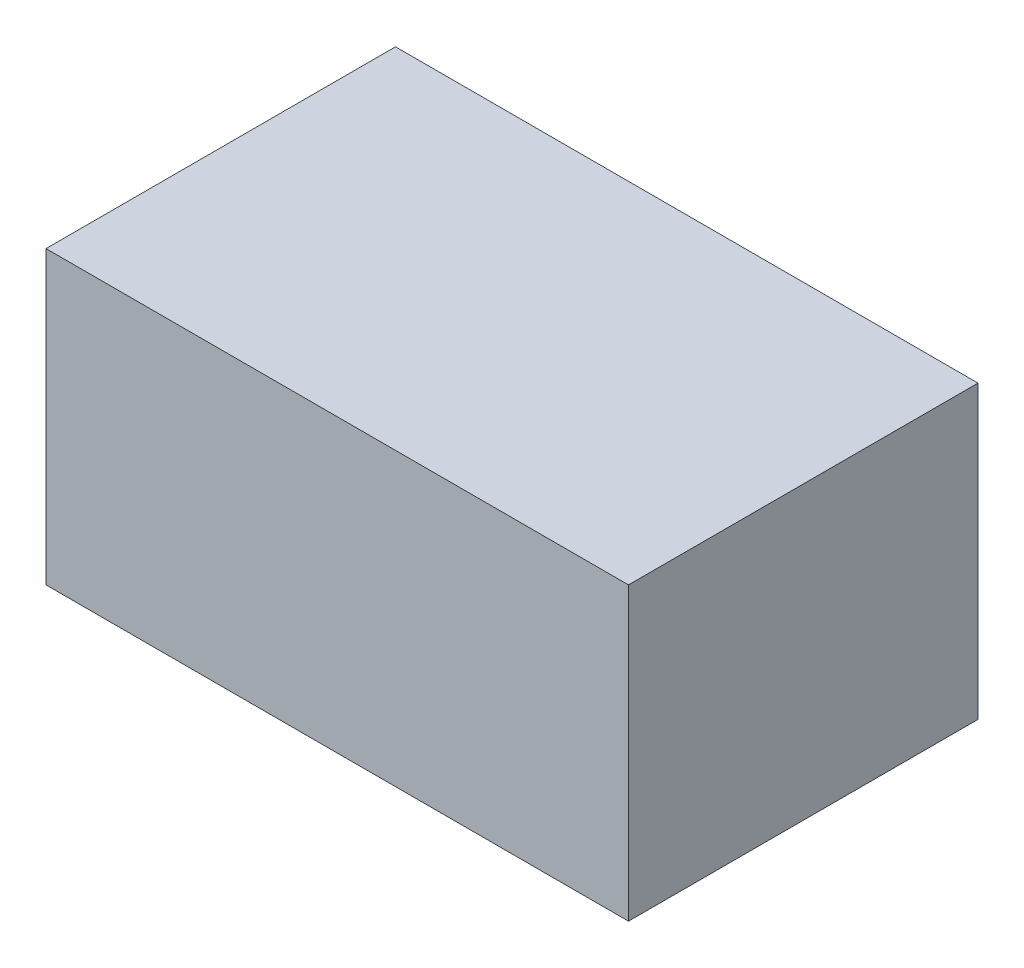
ISO-10303-21;
HEADER;
FILE_DESCRIPTION(('STEP AP214'),'2;1');
FILE_NAME('part.step','',(''),(''),'','','');
FILE_SCHEMA(('AUTOMOTIVE_DESIGN { 1 0 10303 214 1 1 1 1 }'));
ENDSEC;
DATA;
#1=APPLICATION_CONTEXT('core data for automotive mechanical design processes');
#2=APPLICATION_PROTOCOL_DEFINITION('international standard','automotive_design',2000,#1);
#3=PRODUCT_CONTEXT('',#1,'mechanical');
#4=PRODUCT('Part','Part','',(#3));
#5=PRODUCT_RELATED_PRODUCT_CATEGORY('part','',(#4));
#6=PRODUCT_DEFINITION_FORMATION('','',#4);
#7=PRODUCT_DEFINITION_CONTEXT('part definition',#1,'design');
#8=PRODUCT_DEFINITION('design','',#6,#7);
#9=PRODUCT_DEFINITION_SHAPE('','',#8);
#10=(LENGTH_UNIT() NAMED_UNIT(*) SI_UNIT(.MILLI.,.METRE.));
#11=(NAMED_UNIT(*) PLANE_ANGLE_UNIT() SI_UNIT($,.RADIAN.));
#12=(NAMED_UNIT(*) SI_UNIT($,.STERADIAN.) SOLID_ANGLE_UNIT());
#13=UNCERTAINTY_MEASURE_WITH_UNIT(LENGTH_MEASURE(1.E-05),#10,'distance_accuracy_value','');
#14=(GEOMETRIC_REPRESENTATION_CONTEXT(3) GLOBAL_UNCERTAINTY_ASSIGNED_CONTEXT((#13)) GLOBAL_UNIT_ASSIGNED_CONTEXT((#10,
#11,#12)) REPRESENTATION_CONTEXT('',''));
#15=CARTESIAN_POINT('',(0.,0.,0.));
#16=DIRECTION('',(0.,0.,1.));
#17=DIRECTION('',(1.,0.,0.));
#18=AXIS2_PLACEMENT_3D('',#15,#16,#17);
#19=CARTESIAN_POINT('',(-100.,-50.,-60.));
#20=DIRECTION('',(-1.,0.,0.));
#21=DIRECTION('',(0.,0.,1.));
#22=AXIS2_PLACEMENT_3D('',#19,#20,#21);
#23=PLANE('',#22);
#24=DIRECTION('',(0.,1.,0.));
#25=VECTOR('',#24,1.);
#26=CARTESIAN_POINT('',(-100.,-50.,60.));
#27=LINE('',#26,#25);
#28=CARTESIAN_POINT('',(-100.,-50.,60.));
#29=VERTEX_POINT('',#28);
#30=CARTESIAN_POINT('',(-100.,50.,60.));
#31=VERTEX_POINT('',#30);
#32=EDGE_CURVE('E40',#29,#31,#27,.T.);
#33=ORIENTED_EDGE('',*,*,#32,.T.);
#34=DIRECTION('',(0.,0.,1.));
#35=VECTOR('',#34,1.);
#36=CARTESIAN_POINT('',(-100.,50.,-60.));
#37=LINE('',#36,#35);
#38=CARTESIAN_POINT('',(-100.,50.,-60.));
#39=VERTEX_POINT('',#38);
#40=EDGE_CURVE('E77',#39,#31,#37,.T.);
#41=ORIENTED_EDGE('',*,*,#40,.F.);
#42=DIRECTION('',(0.,1.,0.));
#43=VECTOR('',#42,1.);
#44=CARTESIAN_POINT('',(-100.,-50.,-60.));
#45=LINE('',#44,#43);
#46=CARTESIAN_POINT('',(-100.,-50.,-60.));
#47=VERTEX_POINT('',#46);
#48=EDGE_CURVE('E11',#47,#39,#45,.T.);
#49=ORIENTED_EDGE('',*,*,#48,.F.);
#50=DIRECTION('',(0.,0.,1.));
#51=VECTOR('',#50,1.);
#52=CARTESIAN_POINT('',(-100.,-50.,-60.));
#53=LINE('',#52,#51);
#54=EDGE_CURVE('E79',#47,#29,#53,.T.);
#55=ORIENTED_EDGE('',*,*,#54,.T.);
#56=EDGE_LOOP('',(#33,#41,#49,#55));
#57=FACE_BOUND('',#56,.T.);
#58=ADVANCED_FACE('F37',(#57),#23,.T.);
#59=CARTESIAN_POINT('',(-100.,-50.,-60.));
#60=DIRECTION('',(0.,0.,1.));
#61=DIRECTION('',(1.,0.,0.));
#62=AXIS2_PLACEMENT_3D('',#59,#60,#61);
#63=PLANE('',#62);
#64=ORIENTED_EDGE('',*,*,#48,.T.);
#65=DIRECTION('',(1.,0.,0.));
#66=VECTOR('',#65,1.);
#67=CARTESIAN_POINT('',(-100.,50.,-60.));
#68=LINE('',#67,#66);
#69=CARTESIAN_POINT('',(100.,50.,-60.));
#70=VERTEX_POINT('',#69);
#71=EDGE_CURVE('E95',#39,#70,#68,.T.);
#72=ORIENTED_EDGE('',*,*,#71,.T.);
#73=DIRECTION('',(0.,1.,0.));
#74=VECTOR('',#73,1.);
#75=CARTESIAN_POINT('',(100.,-50.,-60.));
#76=LINE('',#75,#74);
#77=CARTESIAN_POINT('',(100.,-50.,-60.));
#78=VERTEX_POINT('',#77);
#79=EDGE_CURVE('E45',#78,#70,#76,.T.);
#80=ORIENTED_EDGE('',*,*,#79,.F.);
#81=DIRECTION('',(1.,0.,0.));
#82=VECTOR('',#81,1.);
#83=CARTESIAN_POINT('',(-100.,-50.,-60.));
#84=LINE('',#83,#82);
#85=EDGE_CURVE('E58',#47,#78,#84,.T.);
#86=ORIENTED_EDGE('',*,*,#85,.F.);
#87=EDGE_LOOP('',(#64,#72,#80,#86));
#88=FACE_BOUND('',#87,.T.);
#89=ADVANCED_FACE('F110',(#88),#63,.F.);
#90=CARTESIAN_POINT('',(100.,-50.,-60.));
#91=DIRECTION('',(-1.,0.,0.));
#92=DIRECTION('',(0.,0.,1.));
#93=AXIS2_PLACEMENT_3D('',#90,#91,#92);
#94=PLANE('',#93);
#95=ORIENTED_EDGE('',*,*,#79,.T.);
#96=DIRECTION('',(0.,0.,1.));
#97=VECTOR('',#96,1.);
#98=CARTESIAN_POINT('',(100.,50.,-60.));
#99=LINE('',#98,#97);
#100=CARTESIAN_POINT('',(100.,50.,60.));
#101=VERTEX_POINT('',#100);
#102=EDGE_CURVE('E91',#70,#101,#99,.T.);
#103=ORIENTED_EDGE('',*,*,#102,.T.);
#104=DIRECTION('',(0.,1.,0.));
#105=VECTOR('',#104,1.);
#106=CARTESIAN_POINT('',(100.,-50.,60.));
#107=LINE('',#106,#105);
#108=CARTESIAN_POINT('',(100.,-50.,60.));
#109=VERTEX_POINT('',#108);
#110=EDGE_CURVE('E83',#109,#101,#107,.T.);
#111=ORIENTED_EDGE('',*,*,#110,.F.);
#112=DIRECTION('',(0.,0.,1.));
#113=VECTOR('',#112,1.);
#114=CARTESIAN_POINT('',(100.,-50.,-60.));
#115=LINE('',#114,#113);
#116=EDGE_CURVE('E103',#78,#109,#115,.T.);
#117=ORIENTED_EDGE('',*,*,#116,.F.);
#118=EDGE_LOOP('',(#95,#103,#111,#117));
#119=FACE_BOUND('',#118,.T.);
#120=ADVANCED_FACE('F108',(#119),#94,.F.);
#121=CARTESIAN_POINT('',(-100.,-50.,60.));
#122=DIRECTION('',(0.,0.,1.));
#123=DIRECTION('',(1.,0.,0.));
#124=AXIS2_PLACEMENT_3D('',#121,#122,#123);
#125=PLANE('',#124);
#126=ORIENTED_EDGE('',*,*,#110,.T.);
#127=DIRECTION('',(1.,0.,0.));
#128=VECTOR('',#127,1.);
#129=CARTESIAN_POINT('',(-100.,50.,60.));
#130=LINE('',#129,#128);
#131=EDGE_CURVE('E85',#31,#101,#130,.T.);
#132=ORIENTED_EDGE('',*,*,#131,.F.);
#133=ORIENTED_EDGE('',*,*,#32,.F.);
#134=DIRECTION('',(1.,0.,0.));
#135=VECTOR('',#134,1.);
#136=CARTESIAN_POINT('',(-100.,-50.,60.));
#137=LINE('',#136,#135);
#138=EDGE_CURVE('E101',#29,#109,#137,.T.);
#139=ORIENTED_EDGE('',*,*,#138,.T.);
#140=EDGE_LOOP('',(#126,#132,#133,#139));
#141=FACE_BOUND('',#140,.T.);
#142=ADVANCED_FACE('F86',(#141),#125,.T.);
#143=CARTESIAN_POINT('',(0.,-50.,0.));
#144=DIRECTION('',(0.,1.,0.));
#145=DIRECTION('',(0.,0.,1.));
#146=AXIS2_PLACEMENT_3D('',#143,#144,#145);
#147=PLANE('',#146);
#148=ORIENTED_EDGE('',*,*,#54,.F.);
#149=ORIENTED_EDGE('',*,*,#85,.T.);
#150=ORIENTED_EDGE('',*,*,#116,.T.);
#151=ORIENTED_EDGE('',*,*,#138,.F.);
#152=EDGE_LOOP('',(#148,#149,#150,#151));
#153=FACE_BOUND('',#152,.T.);
#154=ADVANCED_FACE('F111',(#153),#147,.F.);
#155=CARTESIAN_POINT('',(0.,50.,0.));
#156=DIRECTION('',(0.,1.,0.));
#157=DIRECTION('',(0.,0.,1.));
#158=AXIS2_PLACEMENT_3D('',#155,#156,#157);
#159=PLANE('',#158);
#160=ORIENTED_EDGE('',*,*,#40,.T.);
#161=ORIENTED_EDGE('',*,*,#131,.T.);
#162=ORIENTED_EDGE('',*,*,#102,.F.);
#163=ORIENTED_EDGE('',*,*,#71,.F.);
#164=EDGE_LOOP('',(#160,#161,#162,#163));
#165=FACE_BOUND('',#164,.T.);
#166=ADVANCED_FACE('F93',(#165),#159,.T.);
#167=CLOSED_SHELL('',(#58,#89,#120,#142,#154,#166));
#168=MANIFOLD_SOLID_BREP('B2',#167);
#169=ADVANCED_BREP_SHAPE_REPRESENTATION('',(#18,#168),#14);
#170=SHAPE_DEFINITION_REPRESENTATION(#9,#169);
ENDSEC;
END-ISO-10303-21;
